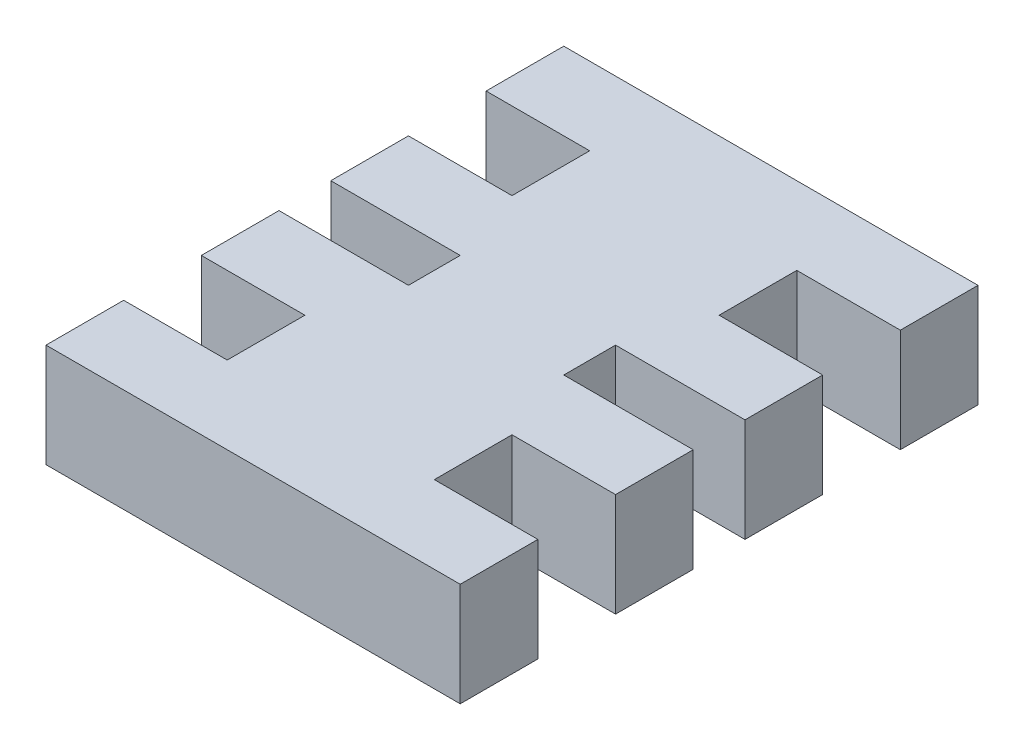
ISO-10303-21;
HEADER;
FILE_DESCRIPTION(('STEP AP214'),'2;1');
FILE_NAME('part.step','',(''),(''),'','','');
FILE_SCHEMA(('AUTOMOTIVE_DESIGN { 1 0 10303 214 1 1 1 1 }'));
ENDSEC;
DATA;
#1=APPLICATION_CONTEXT('core data for automotive mechanical design processes');
#2=APPLICATION_PROTOCOL_DEFINITION('international standard','automotive_design',2000,#1);
#3=PRODUCT_CONTEXT('',#1,'mechanical');
#4=PRODUCT('Part','Part','',(#3));
#5=PRODUCT_RELATED_PRODUCT_CATEGORY('part','',(#4));
#6=PRODUCT_DEFINITION_FORMATION('','',#4);
#7=PRODUCT_DEFINITION_CONTEXT('part definition',#1,'design');
#8=PRODUCT_DEFINITION('design','',#6,#7);
#9=PRODUCT_DEFINITION_SHAPE('','',#8);
#10=(LENGTH_UNIT() NAMED_UNIT(*) SI_UNIT(.MILLI.,.METRE.));
#11=(NAMED_UNIT(*) PLANE_ANGLE_UNIT() SI_UNIT($,.RADIAN.));
#12=(NAMED_UNIT(*) SI_UNIT($,.STERADIAN.) SOLID_ANGLE_UNIT());
#13=UNCERTAINTY_MEASURE_WITH_UNIT(LENGTH_MEASURE(1.E-05),#10,'distance_accuracy_value','');
#14=(GEOMETRIC_REPRESENTATION_CONTEXT(3) GLOBAL_UNCERTAINTY_ASSIGNED_CONTEXT((#13)) GLOBAL_UNIT_ASSIGNED_CONTEXT((#10,
#11,#12)) REPRESENTATION_CONTEXT('',''));
#15=CARTESIAN_POINT('',(0.,0.,0.));
#16=DIRECTION('',(0.,0.,1.));
#17=DIRECTION('',(1.,0.,0.));
#18=AXIS2_PLACEMENT_3D('',#15,#16,#17);
#19=CARTESIAN_POINT('',(-40.,20.,-55.));
#20=DIRECTION('',(1.,0.,0.));
#21=DIRECTION('',(0.,0.,-1.));
#22=AXIS2_PLACEMENT_3D('',#19,#20,#21);
#23=PLANE('',#22);
#24=DIRECTION('',(0.,0.,1.));
#25=VECTOR('',#24,1.);
#26=CARTESIAN_POINT('',(-40.,0.,-55.));
#27=LINE('',#26,#25);
#28=CARTESIAN_POINT('',(-40.,0.,-55.));
#29=VERTEX_POINT('',#28);
#30=CARTESIAN_POINT('',(-40.,0.,-40.));
#31=VERTEX_POINT('',#30);
#32=EDGE_CURVE('E252',#29,#31,#27,.T.);
#33=ORIENTED_EDGE('',*,*,#32,.T.);
#34=DIRECTION('',(0.,-1.,0.));
#35=VECTOR('',#34,1.);
#36=CARTESIAN_POINT('',(-40.,20.,-40.));
#37=LINE('',#36,#35);
#38=CARTESIAN_POINT('',(-40.,20.,-40.));
#39=VERTEX_POINT('',#38);
#40=EDGE_CURVE('E11',#39,#31,#37,.T.);
#41=ORIENTED_EDGE('',*,*,#40,.F.);
#42=DIRECTION('',(0.,0.,1.));
#43=VECTOR('',#42,1.);
#44=CARTESIAN_POINT('',(-40.,20.,-55.));
#45=LINE('',#44,#43);
#46=CARTESIAN_POINT('',(-40.,20.,-55.));
#47=VERTEX_POINT('',#46);
#48=EDGE_CURVE('E306',#47,#39,#45,.T.);
#49=ORIENTED_EDGE('',*,*,#48,.F.);
#50=DIRECTION('',(0.,-1.,0.));
#51=VECTOR('',#50,1.);
#52=CARTESIAN_POINT('',(-40.,20.,-55.));
#53=LINE('',#52,#51);
#54=EDGE_CURVE('E248',#47,#29,#53,.T.);
#55=ORIENTED_EDGE('',*,*,#54,.T.);
#56=EDGE_LOOP('',(#33,#41,#49,#55));
#57=FACE_BOUND('',#56,.T.);
#58=ADVANCED_FACE('F36',(#57),#23,.F.);
#59=CARTESIAN_POINT('',(-40.,20.,-40.));
#60=DIRECTION('',(0.,0.,-1.));
#61=DIRECTION('',(-1.,0.,0.));
#62=AXIS2_PLACEMENT_3D('',#59,#60,#61);
#63=PLANE('',#62);
#64=DIRECTION('',(1.,0.,0.));
#65=VECTOR('',#64,1.);
#66=CARTESIAN_POINT('',(-40.,0.,-40.));
#67=LINE('',#66,#65);
#68=CARTESIAN_POINT('',(-20.,0.,-40.));
#69=VERTEX_POINT('',#68);
#70=EDGE_CURVE('E255',#31,#69,#67,.T.);
#71=ORIENTED_EDGE('',*,*,#70,.T.);
#72=DIRECTION('',(0.,-1.,0.));
#73=VECTOR('',#72,1.);
#74=CARTESIAN_POINT('',(-20.,20.,-40.));
#75=LINE('',#74,#73);
#76=CARTESIAN_POINT('',(-20.,20.,-40.));
#77=VERTEX_POINT('',#76);
#78=EDGE_CURVE('E44',#77,#69,#75,.T.);
#79=ORIENTED_EDGE('',*,*,#78,.F.);
#80=DIRECTION('',(1.,0.,0.));
#81=VECTOR('',#80,1.);
#82=CARTESIAN_POINT('',(-40.,20.,-40.));
#83=LINE('',#82,#81);
#84=EDGE_CURVE('E155',#39,#77,#83,.T.);
#85=ORIENTED_EDGE('',*,*,#84,.F.);
#86=ORIENTED_EDGE('',*,*,#40,.T.);
#87=EDGE_LOOP('',(#71,#79,#85,#86));
#88=FACE_BOUND('',#87,.T.);
#89=ADVANCED_FACE('F464',(#88),#63,.F.);
#90=CARTESIAN_POINT('',(-20.,20.,-40.));
#91=DIRECTION('',(1.,0.,0.));
#92=DIRECTION('',(0.,0.,-1.));
#93=AXIS2_PLACEMENT_3D('',#90,#91,#92);
#94=PLANE('',#93);
#95=DIRECTION('',(0.,0.,1.));
#96=VECTOR('',#95,1.);
#97=CARTESIAN_POINT('',(-20.,0.,-40.));
#98=LINE('',#97,#96);
#99=CARTESIAN_POINT('',(-20.,0.,-25.));
#100=VERTEX_POINT('',#99);
#101=EDGE_CURVE('E257',#69,#100,#98,.T.);
#102=ORIENTED_EDGE('',*,*,#101,.T.);
#103=DIRECTION('',(0.,-1.,0.));
#104=VECTOR('',#103,1.);
#105=CARTESIAN_POINT('',(-20.,20.,-25.));
#106=LINE('',#105,#104);
#107=CARTESIAN_POINT('',(-20.,20.,-25.));
#108=VERTEX_POINT('',#107);
#109=EDGE_CURVE('E373',#108,#100,#106,.T.);
#110=ORIENTED_EDGE('',*,*,#109,.F.);
#111=DIRECTION('',(0.,0.,1.));
#112=VECTOR('',#111,1.);
#113=CARTESIAN_POINT('',(-20.,20.,-40.));
#114=LINE('',#113,#112);
#115=EDGE_CURVE('E381',#77,#108,#114,.T.);
#116=ORIENTED_EDGE('',*,*,#115,.F.);
#117=ORIENTED_EDGE('',*,*,#78,.T.);
#118=EDGE_LOOP('',(#102,#110,#116,#117));
#119=FACE_BOUND('',#118,.T.);
#120=ADVANCED_FACE('F379',(#119),#94,.F.);
#121=CARTESIAN_POINT('',(-20.,20.,-25.));
#122=DIRECTION('',(0.,0.,1.));
#123=DIRECTION('',(1.,0.,0.));
#124=AXIS2_PLACEMENT_3D('',#121,#122,#123);
#125=PLANE('',#124);
#126=DIRECTION('',(-1.,0.,0.));
#127=VECTOR('',#126,1.);
#128=CARTESIAN_POINT('',(-20.,0.,-25.));
#129=LINE('',#128,#127);
#130=CARTESIAN_POINT('',(-40.,0.,-25.));
#131=VERTEX_POINT('',#130);
#132=EDGE_CURVE('E259',#100,#131,#129,.T.);
#133=ORIENTED_EDGE('',*,*,#132,.T.);
#134=DIRECTION('',(0.,-1.,0.));
#135=VECTOR('',#134,1.);
#136=CARTESIAN_POINT('',(-40.,20.,-25.));
#137=LINE('',#136,#135);
#138=CARTESIAN_POINT('',(-40.,20.,-25.));
#139=VERTEX_POINT('',#138);
#140=EDGE_CURVE('E370',#139,#131,#137,.T.);
#141=ORIENTED_EDGE('',*,*,#140,.F.);
#142=DIRECTION('',(-1.,0.,0.));
#143=VECTOR('',#142,1.);
#144=CARTESIAN_POINT('',(-20.,20.,-25.));
#145=LINE('',#144,#143);
#146=EDGE_CURVE('E399',#108,#139,#145,.T.);
#147=ORIENTED_EDGE('',*,*,#146,.F.);
#148=ORIENTED_EDGE('',*,*,#109,.T.);
#149=EDGE_LOOP('',(#133,#141,#147,#148));
#150=FACE_BOUND('',#149,.T.);
#151=ADVANCED_FACE('F390',(#150),#125,.F.);
#152=CARTESIAN_POINT('',(-40.,20.,-25.));
#153=DIRECTION('',(1.,0.,0.));
#154=DIRECTION('',(0.,0.,-1.));
#155=AXIS2_PLACEMENT_3D('',#152,#153,#154);
#156=PLANE('',#155);
#157=DIRECTION('',(0.,0.,1.));
#158=VECTOR('',#157,1.);
#159=CARTESIAN_POINT('',(-40.,0.,-25.));
#160=LINE('',#159,#158);
#161=CARTESIAN_POINT('',(-40.,0.,-10.));
#162=VERTEX_POINT('',#161);
#163=EDGE_CURVE('E261',#131,#162,#160,.T.);
#164=ORIENTED_EDGE('',*,*,#163,.T.);
#165=DIRECTION('',(0.,-1.,0.));
#166=VECTOR('',#165,1.);
#167=CARTESIAN_POINT('',(-40.,20.,-10.));
#168=LINE('',#167,#166);
#169=CARTESIAN_POINT('',(-40.,20.,-10.));
#170=VERTEX_POINT('',#169);
#171=EDGE_CURVE('E367',#170,#162,#168,.T.);
#172=ORIENTED_EDGE('',*,*,#171,.F.);
#173=DIRECTION('',(0.,0.,1.));
#174=VECTOR('',#173,1.);
#175=CARTESIAN_POINT('',(-40.,20.,-25.));
#176=LINE('',#175,#174);
#177=EDGE_CURVE('E396',#139,#170,#176,.T.);
#178=ORIENTED_EDGE('',*,*,#177,.F.);
#179=ORIENTED_EDGE('',*,*,#140,.T.);
#180=EDGE_LOOP('',(#164,#172,#178,#179));
#181=FACE_BOUND('',#180,.T.);
#182=ADVANCED_FACE('F394',(#181),#156,.F.);
#183=CARTESIAN_POINT('',(-40.,20.,-10.));
#184=DIRECTION('',(0.,0.,-1.));
#185=DIRECTION('',(-1.,0.,0.));
#186=AXIS2_PLACEMENT_3D('',#183,#184,#185);
#187=PLANE('',#186);
#188=DIRECTION('',(1.,0.,0.));
#189=VECTOR('',#188,1.);
#190=CARTESIAN_POINT('',(-40.,0.,-10.));
#191=LINE('',#190,#189);
#192=CARTESIAN_POINT('',(-15.,0.,-10.));
#193=VERTEX_POINT('',#192);
#194=EDGE_CURVE('E263',#162,#193,#191,.T.);
#195=ORIENTED_EDGE('',*,*,#194,.T.);
#196=DIRECTION('',(0.,-1.,0.));
#197=VECTOR('',#196,1.);
#198=CARTESIAN_POINT('',(-15.,20.,-10.));
#199=LINE('',#198,#197);
#200=CARTESIAN_POINT('',(-15.,20.,-10.));
#201=VERTEX_POINT('',#200);
#202=EDGE_CURVE('E364',#201,#193,#199,.T.);
#203=ORIENTED_EDGE('',*,*,#202,.F.);
#204=DIRECTION('',(1.,0.,0.));
#205=VECTOR('',#204,1.);
#206=CARTESIAN_POINT('',(-40.,20.,-10.));
#207=LINE('',#206,#205);
#208=EDGE_CURVE('E398',#170,#201,#207,.T.);
#209=ORIENTED_EDGE('',*,*,#208,.F.);
#210=ORIENTED_EDGE('',*,*,#171,.T.);
#211=EDGE_LOOP('',(#195,#203,#209,#210));
#212=FACE_BOUND('',#211,.T.);
#213=ADVANCED_FACE('F477',(#212),#187,.F.);
#214=CARTESIAN_POINT('',(-15.,20.,-10.));
#215=DIRECTION('',(1.,0.,0.));
#216=DIRECTION('',(0.,0.,-1.));
#217=AXIS2_PLACEMENT_3D('',#214,#215,#216);
#218=PLANE('',#217);
#219=DIRECTION('',(0.,0.,1.));
#220=VECTOR('',#219,1.);
#221=CARTESIAN_POINT('',(-15.,0.,-10.));
#222=LINE('',#221,#220);
#223=CARTESIAN_POINT('',(-15.,0.,0.));
#224=VERTEX_POINT('',#223);
#225=EDGE_CURVE('E265',#193,#224,#222,.T.);
#226=ORIENTED_EDGE('',*,*,#225,.T.);
#227=DIRECTION('',(0.,-1.,0.));
#228=VECTOR('',#227,1.);
#229=CARTESIAN_POINT('',(-15.,20.,0.));
#230=LINE('',#229,#228);
#231=CARTESIAN_POINT('',(-15.,20.,0.));
#232=VERTEX_POINT('',#231);
#233=EDGE_CURVE('E361',#232,#224,#230,.T.);
#234=ORIENTED_EDGE('',*,*,#233,.F.);
#235=DIRECTION('',(0.,0.,1.));
#236=VECTOR('',#235,1.);
#237=CARTESIAN_POINT('',(-15.,20.,-10.));
#238=LINE('',#237,#236);
#239=EDGE_CURVE('E401',#201,#232,#238,.T.);
#240=ORIENTED_EDGE('',*,*,#239,.F.);
#241=ORIENTED_EDGE('',*,*,#202,.T.);
#242=EDGE_LOOP('',(#226,#234,#240,#241));
#243=FACE_BOUND('',#242,.T.);
#244=ADVANCED_FACE('F480',(#243),#218,.F.);
#245=CARTESIAN_POINT('',(-15.,20.,0.));
#246=DIRECTION('',(0.,0.,1.));
#247=DIRECTION('',(1.,0.,0.));
#248=AXIS2_PLACEMENT_3D('',#245,#246,#247);
#249=PLANE('',#248);
#250=DIRECTION('',(-1.,0.,0.));
#251=VECTOR('',#250,1.);
#252=CARTESIAN_POINT('',(-15.,0.,0.));
#253=LINE('',#252,#251);
#254=CARTESIAN_POINT('',(-40.,0.,0.));
#255=VERTEX_POINT('',#254);
#256=EDGE_CURVE('E267',#224,#255,#253,.T.);
#257=ORIENTED_EDGE('',*,*,#256,.T.);
#258=DIRECTION('',(0.,-1.,0.));
#259=VECTOR('',#258,1.);
#260=CARTESIAN_POINT('',(-40.,20.,0.));
#261=LINE('',#260,#259);
#262=CARTESIAN_POINT('',(-40.,20.,0.));
#263=VERTEX_POINT('',#262);
#264=EDGE_CURVE('E358',#263,#255,#261,.T.);
#265=ORIENTED_EDGE('',*,*,#264,.F.);
#266=DIRECTION('',(-1.,0.,0.));
#267=VECTOR('',#266,1.);
#268=CARTESIAN_POINT('',(-15.,20.,0.));
#269=LINE('',#268,#267);
#270=EDGE_CURVE('E407',#232,#263,#269,.T.);
#271=ORIENTED_EDGE('',*,*,#270,.F.);
#272=ORIENTED_EDGE('',*,*,#233,.T.);
#273=EDGE_LOOP('',(#257,#265,#271,#272));
#274=FACE_BOUND('',#273,.T.);
#275=ADVANCED_FACE('F484',(#274),#249,.F.);
#276=CARTESIAN_POINT('',(-40.,20.,0.));
#277=DIRECTION('',(1.,0.,0.));
#278=DIRECTION('',(0.,0.,-1.));
#279=AXIS2_PLACEMENT_3D('',#276,#277,#278);
#280=PLANE('',#279);
#281=DIRECTION('',(0.,0.,1.));
#282=VECTOR('',#281,1.);
#283=CARTESIAN_POINT('',(-40.,0.,0.));
#284=LINE('',#283,#282);
#285=CARTESIAN_POINT('',(-40.,0.,15.));
#286=VERTEX_POINT('',#285);
#287=EDGE_CURVE('E269',#255,#286,#284,.T.);
#288=ORIENTED_EDGE('',*,*,#287,.T.);
#289=DIRECTION('',(0.,-1.,0.));
#290=VECTOR('',#289,1.);
#291=CARTESIAN_POINT('',(-40.,20.,15.));
#292=LINE('',#291,#290);
#293=CARTESIAN_POINT('',(-40.,20.,15.));
#294=VERTEX_POINT('',#293);
#295=EDGE_CURVE('E355',#294,#286,#292,.T.);
#296=ORIENTED_EDGE('',*,*,#295,.F.);
#297=DIRECTION('',(0.,0.,1.));
#298=VECTOR('',#297,1.);
#299=CARTESIAN_POINT('',(-40.,20.,0.));
#300=LINE('',#299,#298);
#301=EDGE_CURVE('E409',#263,#294,#300,.T.);
#302=ORIENTED_EDGE('',*,*,#301,.F.);
#303=ORIENTED_EDGE('',*,*,#264,.T.);
#304=EDGE_LOOP('',(#288,#296,#302,#303));
#305=FACE_BOUND('',#304,.T.);
#306=ADVANCED_FACE('F488',(#305),#280,.F.);
#307=CARTESIAN_POINT('',(-40.,20.,15.));
#308=DIRECTION('',(0.,0.,-1.));
#309=DIRECTION('',(-1.,0.,0.));
#310=AXIS2_PLACEMENT_3D('',#307,#308,#309);
#311=PLANE('',#310);
#312=DIRECTION('',(1.,0.,0.));
#313=VECTOR('',#312,1.);
#314=CARTESIAN_POINT('',(-40.,0.,15.));
#315=LINE('',#314,#313);
#316=CARTESIAN_POINT('',(-20.,0.,15.));
#317=VERTEX_POINT('',#316);
#318=EDGE_CURVE('E271',#286,#317,#315,.T.);
#319=ORIENTED_EDGE('',*,*,#318,.T.);
#320=DIRECTION('',(0.,-1.,0.));
#321=VECTOR('',#320,1.);
#322=CARTESIAN_POINT('',(-20.,20.,15.));
#323=LINE('',#322,#321);
#324=CARTESIAN_POINT('',(-20.,20.,15.));
#325=VERTEX_POINT('',#324);
#326=EDGE_CURVE('E352',#325,#317,#323,.T.);
#327=ORIENTED_EDGE('',*,*,#326,.F.);
#328=DIRECTION('',(1.,0.,0.));
#329=VECTOR('',#328,1.);
#330=CARTESIAN_POINT('',(-40.,20.,15.));
#331=LINE('',#330,#329);
#332=EDGE_CURVE('E411',#294,#325,#331,.T.);
#333=ORIENTED_EDGE('',*,*,#332,.F.);
#334=ORIENTED_EDGE('',*,*,#295,.T.);
#335=EDGE_LOOP('',(#319,#327,#333,#334));
#336=FACE_BOUND('',#335,.T.);
#337=ADVANCED_FACE('F492',(#336),#311,.F.);
#338=CARTESIAN_POINT('',(-20.,20.,15.));
#339=DIRECTION('',(1.,0.,0.));
#340=DIRECTION('',(0.,0.,-1.));
#341=AXIS2_PLACEMENT_3D('',#338,#339,#340);
#342=PLANE('',#341);
#343=DIRECTION('',(0.,0.,1.));
#344=VECTOR('',#343,1.);
#345=CARTESIAN_POINT('',(-20.,0.,15.));
#346=LINE('',#345,#344);
#347=CARTESIAN_POINT('',(-20.,0.,30.));
#348=VERTEX_POINT('',#347);
#349=EDGE_CURVE('E273',#317,#348,#346,.T.);
#350=ORIENTED_EDGE('',*,*,#349,.T.);
#351=DIRECTION('',(0.,-1.,0.));
#352=VECTOR('',#351,1.);
#353=CARTESIAN_POINT('',(-20.,20.,30.));
#354=LINE('',#353,#352);
#355=CARTESIAN_POINT('',(-20.,20.,30.));
#356=VERTEX_POINT('',#355);
#357=EDGE_CURVE('E349',#356,#348,#354,.T.);
#358=ORIENTED_EDGE('',*,*,#357,.F.);
#359=DIRECTION('',(0.,0.,1.));
#360=VECTOR('',#359,1.);
#361=CARTESIAN_POINT('',(-20.,20.,15.));
#362=LINE('',#361,#360);
#363=EDGE_CURVE('E413',#325,#356,#362,.T.);
#364=ORIENTED_EDGE('',*,*,#363,.F.);
#365=ORIENTED_EDGE('',*,*,#326,.T.);
#366=EDGE_LOOP('',(#350,#358,#364,#365));
#367=FACE_BOUND('',#366,.T.);
#368=ADVANCED_FACE('F496',(#367),#342,.F.);
#369=CARTESIAN_POINT('',(-20.,20.,30.));
#370=DIRECTION('',(0.,0.,1.));
#371=DIRECTION('',(1.,0.,0.));
#372=AXIS2_PLACEMENT_3D('',#369,#370,#371);
#373=PLANE('',#372);
#374=DIRECTION('',(-1.,0.,0.));
#375=VECTOR('',#374,1.);
#376=CARTESIAN_POINT('',(-20.,0.,30.));
#377=LINE('',#376,#375);
#378=CARTESIAN_POINT('',(-40.,0.,30.));
#379=VERTEX_POINT('',#378);
#380=EDGE_CURVE('E275',#348,#379,#377,.T.);
#381=ORIENTED_EDGE('',*,*,#380,.T.);
#382=DIRECTION('',(0.,-1.,0.));
#383=VECTOR('',#382,1.);
#384=CARTESIAN_POINT('',(-40.,20.,30.));
#385=LINE('',#384,#383);
#386=CARTESIAN_POINT('',(-40.,20.,30.));
#387=VERTEX_POINT('',#386);
#388=EDGE_CURVE('E346',#387,#379,#385,.T.);
#389=ORIENTED_EDGE('',*,*,#388,.F.);
#390=DIRECTION('',(-1.,0.,0.));
#391=VECTOR('',#390,1.);
#392=CARTESIAN_POINT('',(-20.,20.,30.));
#393=LINE('',#392,#391);
#394=EDGE_CURVE('E415',#356,#387,#393,.T.);
#395=ORIENTED_EDGE('',*,*,#394,.F.);
#396=ORIENTED_EDGE('',*,*,#357,.T.);
#397=EDGE_LOOP('',(#381,#389,#395,#396));
#398=FACE_BOUND('',#397,.T.);
#399=ADVANCED_FACE('F500',(#398),#373,.F.);
#400=CARTESIAN_POINT('',(-40.,20.,30.));
#401=DIRECTION('',(1.,0.,0.));
#402=DIRECTION('',(0.,0.,-1.));
#403=AXIS2_PLACEMENT_3D('',#400,#401,#402);
#404=PLANE('',#403);
#405=DIRECTION('',(0.,0.,1.));
#406=VECTOR('',#405,1.);
#407=CARTESIAN_POINT('',(-40.,0.,30.));
#408=LINE('',#407,#406);
#409=CARTESIAN_POINT('',(-40.,0.,45.));
#410=VERTEX_POINT('',#409);
#411=EDGE_CURVE('E277',#379,#410,#408,.T.);
#412=ORIENTED_EDGE('',*,*,#411,.T.);
#413=DIRECTION('',(0.,-1.,0.));
#414=VECTOR('',#413,1.);
#415=CARTESIAN_POINT('',(-40.,20.,45.));
#416=LINE('',#415,#414);
#417=CARTESIAN_POINT('',(-40.,20.,45.));
#418=VERTEX_POINT('',#417);
#419=EDGE_CURVE('E343',#418,#410,#416,.T.);
#420=ORIENTED_EDGE('',*,*,#419,.F.);
#421=DIRECTION('',(0.,0.,1.));
#422=VECTOR('',#421,1.);
#423=CARTESIAN_POINT('',(-40.,20.,30.));
#424=LINE('',#423,#422);
#425=EDGE_CURVE('E417',#387,#418,#424,.T.);
#426=ORIENTED_EDGE('',*,*,#425,.F.);
#427=ORIENTED_EDGE('',*,*,#388,.T.);
#428=EDGE_LOOP('',(#412,#420,#426,#427));
#429=FACE_BOUND('',#428,.T.);
#430=ADVANCED_FACE('F504',(#429),#404,.F.);
#431=CARTESIAN_POINT('',(-40.,20.,45.));
#432=DIRECTION('',(0.,0.,-1.));
#433=DIRECTION('',(-1.,0.,0.));
#434=AXIS2_PLACEMENT_3D('',#431,#432,#433);
#435=PLANE('',#434);
#436=DIRECTION('',(1.,0.,0.));
#437=VECTOR('',#436,1.);
#438=CARTESIAN_POINT('',(-40.,0.,45.));
#439=LINE('',#438,#437);
#440=CARTESIAN_POINT('',(40.,0.,45.));
#441=VERTEX_POINT('',#440);
#442=EDGE_CURVE('E279',#410,#441,#439,.T.);
#443=ORIENTED_EDGE('',*,*,#442,.T.);
#444=DIRECTION('',(0.,-1.,0.));
#445=VECTOR('',#444,1.);
#446=CARTESIAN_POINT('',(40.,20.,45.));
#447=LINE('',#446,#445);
#448=CARTESIAN_POINT('',(40.,20.,45.));
#449=VERTEX_POINT('',#448);
#450=EDGE_CURVE('E340',#449,#441,#447,.T.);
#451=ORIENTED_EDGE('',*,*,#450,.F.);
#452=DIRECTION('',(1.,0.,0.));
#453=VECTOR('',#452,1.);
#454=CARTESIAN_POINT('',(-40.,20.,45.));
#455=LINE('',#454,#453);
#456=EDGE_CURVE('E419',#418,#449,#455,.T.);
#457=ORIENTED_EDGE('',*,*,#456,.F.);
#458=ORIENTED_EDGE('',*,*,#419,.T.);
#459=EDGE_LOOP('',(#443,#451,#457,#458));
#460=FACE_BOUND('',#459,.T.);
#461=ADVANCED_FACE('F508',(#460),#435,.F.);
#462=CARTESIAN_POINT('',(40.,20.,30.));
#463=DIRECTION('',(-1.,0.,0.));
#464=DIRECTION('',(0.,0.,1.));
#465=AXIS2_PLACEMENT_3D('',#462,#463,#464);
#466=PLANE('',#465);
#467=DIRECTION('',(0.,0.,-1.));
#468=VECTOR('',#467,1.);
#469=CARTESIAN_POINT('',(40.,0.,30.));
#470=LINE('',#469,#468);
#471=CARTESIAN_POINT('',(40.,0.,30.));
#472=VERTEX_POINT('',#471);
#473=EDGE_CURVE('E281',#441,#472,#470,.T.);
#474=ORIENTED_EDGE('',*,*,#473,.T.);
#475=DIRECTION('',(0.,-1.,0.));
#476=VECTOR('',#475,1.);
#477=CARTESIAN_POINT('',(40.,20.,30.));
#478=LINE('',#477,#476);
#479=CARTESIAN_POINT('',(40.,20.,30.));
#480=VERTEX_POINT('',#479);
#481=EDGE_CURVE('E337',#480,#472,#478,.T.);
#482=ORIENTED_EDGE('',*,*,#481,.F.);
#483=DIRECTION('',(0.,0.,-1.));
#484=VECTOR('',#483,1.);
#485=CARTESIAN_POINT('',(40.,20.,30.));
#486=LINE('',#485,#484);
#487=EDGE_CURVE('E421',#449,#480,#486,.T.);
#488=ORIENTED_EDGE('',*,*,#487,.F.);
#489=ORIENTED_EDGE('',*,*,#450,.T.);
#490=EDGE_LOOP('',(#474,#482,#488,#489));
#491=FACE_BOUND('',#490,.T.);
#492=ADVANCED_FACE('F512',(#491),#466,.F.);
#493=CARTESIAN_POINT('',(20.,20.,30.));
#494=DIRECTION('',(0.,0.,1.));
#495=DIRECTION('',(1.,0.,0.));
#496=AXIS2_PLACEMENT_3D('',#493,#494,#495);
#497=PLANE('',#496);
#498=DIRECTION('',(-1.,0.,0.));
#499=VECTOR('',#498,1.);
#500=CARTESIAN_POINT('',(20.,0.,30.));
#501=LINE('',#500,#499);
#502=CARTESIAN_POINT('',(20.,0.,30.));
#503=VERTEX_POINT('',#502);
#504=EDGE_CURVE('E283',#472,#503,#501,.T.);
#505=ORIENTED_EDGE('',*,*,#504,.T.);
#506=DIRECTION('',(0.,-1.,0.));
#507=VECTOR('',#506,1.);
#508=CARTESIAN_POINT('',(20.,20.,30.));
#509=LINE('',#508,#507);
#510=CARTESIAN_POINT('',(20.,20.,30.));
#511=VERTEX_POINT('',#510);
#512=EDGE_CURVE('E334',#511,#503,#509,.T.);
#513=ORIENTED_EDGE('',*,*,#512,.F.);
#514=DIRECTION('',(-1.,0.,0.));
#515=VECTOR('',#514,1.);
#516=CARTESIAN_POINT('',(20.,20.,30.));
#517=LINE('',#516,#515);
#518=EDGE_CURVE('E423',#480,#511,#517,.T.);
#519=ORIENTED_EDGE('',*,*,#518,.F.);
#520=ORIENTED_EDGE('',*,*,#481,.T.);
#521=EDGE_LOOP('',(#505,#513,#519,#520));
#522=FACE_BOUND('',#521,.T.);
#523=ADVANCED_FACE('F516',(#522),#497,.F.);
#524=CARTESIAN_POINT('',(20.,20.,15.));
#525=DIRECTION('',(-1.,0.,0.));
#526=DIRECTION('',(0.,0.,1.));
#527=AXIS2_PLACEMENT_3D('',#524,#525,#526);
#528=PLANE('',#527);
#529=DIRECTION('',(0.,0.,-1.));
#530=VECTOR('',#529,1.);
#531=CARTESIAN_POINT('',(20.,0.,15.));
#532=LINE('',#531,#530);
#533=CARTESIAN_POINT('',(20.,0.,15.));
#534=VERTEX_POINT('',#533);
#535=EDGE_CURVE('E285',#503,#534,#532,.T.);
#536=ORIENTED_EDGE('',*,*,#535,.T.);
#537=DIRECTION('',(0.,-1.,0.));
#538=VECTOR('',#537,1.);
#539=CARTESIAN_POINT('',(20.,20.,15.));
#540=LINE('',#539,#538);
#541=CARTESIAN_POINT('',(20.,20.,15.));
#542=VERTEX_POINT('',#541);
#543=EDGE_CURVE('E331',#542,#534,#540,.T.);
#544=ORIENTED_EDGE('',*,*,#543,.F.);
#545=DIRECTION('',(0.,0.,-1.));
#546=VECTOR('',#545,1.);
#547=CARTESIAN_POINT('',(20.,20.,15.));
#548=LINE('',#547,#546);
#549=EDGE_CURVE('E425',#511,#542,#548,.T.);
#550=ORIENTED_EDGE('',*,*,#549,.F.);
#551=ORIENTED_EDGE('',*,*,#512,.T.);
#552=EDGE_LOOP('',(#536,#544,#550,#551));
#553=FACE_BOUND('',#552,.T.);
#554=ADVANCED_FACE('F520',(#553),#528,.F.);
#555=CARTESIAN_POINT('',(40.,20.,15.));
#556=DIRECTION('',(0.,0.,-1.));
#557=DIRECTION('',(-1.,0.,0.));
#558=AXIS2_PLACEMENT_3D('',#555,#556,#557);
#559=PLANE('',#558);
#560=DIRECTION('',(1.,0.,0.));
#561=VECTOR('',#560,1.);
#562=CARTESIAN_POINT('',(40.,0.,15.));
#563=LINE('',#562,#561);
#564=CARTESIAN_POINT('',(40.,0.,15.));
#565=VERTEX_POINT('',#564);
#566=EDGE_CURVE('E287',#534,#565,#563,.T.);
#567=ORIENTED_EDGE('',*,*,#566,.T.);
#568=DIRECTION('',(0.,-1.,0.));
#569=VECTOR('',#568,1.);
#570=CARTESIAN_POINT('',(40.,20.,15.));
#571=LINE('',#570,#569);
#572=CARTESIAN_POINT('',(40.,20.,15.));
#573=VERTEX_POINT('',#572);
#574=EDGE_CURVE('E328',#573,#565,#571,.T.);
#575=ORIENTED_EDGE('',*,*,#574,.F.);
#576=DIRECTION('',(1.,0.,0.));
#577=VECTOR('',#576,1.);
#578=CARTESIAN_POINT('',(40.,20.,15.));
#579=LINE('',#578,#577);
#580=EDGE_CURVE('E427',#542,#573,#579,.T.);
#581=ORIENTED_EDGE('',*,*,#580,.F.);
#582=ORIENTED_EDGE('',*,*,#543,.T.);
#583=EDGE_LOOP('',(#567,#575,#581,#582));
#584=FACE_BOUND('',#583,.T.);
#585=ADVANCED_FACE('F524',(#584),#559,.F.);
#586=CARTESIAN_POINT('',(40.,20.,0.));
#587=DIRECTION('',(-1.,0.,0.));
#588=DIRECTION('',(0.,0.,1.));
#589=AXIS2_PLACEMENT_3D('',#586,#587,#588);
#590=PLANE('',#589);
#591=DIRECTION('',(0.,0.,-1.));
#592=VECTOR('',#591,1.);
#593=CARTESIAN_POINT('',(40.,0.,0.));
#594=LINE('',#593,#592);
#595=CARTESIAN_POINT('',(40.,0.,0.));
#596=VERTEX_POINT('',#595);
#597=EDGE_CURVE('E289',#565,#596,#594,.T.);
#598=ORIENTED_EDGE('',*,*,#597,.T.);
#599=DIRECTION('',(0.,-1.,0.));
#600=VECTOR('',#599,1.);
#601=CARTESIAN_POINT('',(40.,20.,0.));
#602=LINE('',#601,#600);
#603=CARTESIAN_POINT('',(40.,20.,0.));
#604=VERTEX_POINT('',#603);
#605=EDGE_CURVE('E325',#604,#596,#602,.T.);
#606=ORIENTED_EDGE('',*,*,#605,.F.);
#607=DIRECTION('',(0.,0.,-1.));
#608=VECTOR('',#607,1.);
#609=CARTESIAN_POINT('',(40.,20.,0.));
#610=LINE('',#609,#608);
#611=EDGE_CURVE('E429',#573,#604,#610,.T.);
#612=ORIENTED_EDGE('',*,*,#611,.F.);
#613=ORIENTED_EDGE('',*,*,#574,.T.);
#614=EDGE_LOOP('',(#598,#606,#612,#613));
#615=FACE_BOUND('',#614,.T.);
#616=ADVANCED_FACE('F528',(#615),#590,.F.);
#617=CARTESIAN_POINT('',(15.,20.,0.));
#618=DIRECTION('',(0.,0.,1.));
#619=DIRECTION('',(1.,0.,0.));
#620=AXIS2_PLACEMENT_3D('',#617,#618,#619);
#621=PLANE('',#620);
#622=DIRECTION('',(-1.,0.,0.));
#623=VECTOR('',#622,1.);
#624=CARTESIAN_POINT('',(15.,0.,0.));
#625=LINE('',#624,#623);
#626=CARTESIAN_POINT('',(15.,0.,0.));
#627=VERTEX_POINT('',#626);
#628=EDGE_CURVE('E291',#596,#627,#625,.T.);
#629=ORIENTED_EDGE('',*,*,#628,.T.);
#630=DIRECTION('',(0.,-1.,0.));
#631=VECTOR('',#630,1.);
#632=CARTESIAN_POINT('',(15.,20.,0.));
#633=LINE('',#632,#631);
#634=CARTESIAN_POINT('',(15.,20.,0.));
#635=VERTEX_POINT('',#634);
#636=EDGE_CURVE('E322',#635,#627,#633,.T.);
#637=ORIENTED_EDGE('',*,*,#636,.F.);
#638=DIRECTION('',(-1.,0.,0.));
#639=VECTOR('',#638,1.);
#640=CARTESIAN_POINT('',(15.,20.,0.));
#641=LINE('',#640,#639);
#642=EDGE_CURVE('E431',#604,#635,#641,.T.);
#643=ORIENTED_EDGE('',*,*,#642,.F.);
#644=ORIENTED_EDGE('',*,*,#605,.T.);
#645=EDGE_LOOP('',(#629,#637,#643,#644));
#646=FACE_BOUND('',#645,.T.);
#647=ADVANCED_FACE('F532',(#646),#621,.F.);
#648=CARTESIAN_POINT('',(15.,20.,-10.));
#649=DIRECTION('',(-1.,0.,0.));
#650=DIRECTION('',(0.,0.,1.));
#651=AXIS2_PLACEMENT_3D('',#648,#649,#650);
#652=PLANE('',#651);
#653=DIRECTION('',(0.,0.,-1.));
#654=VECTOR('',#653,1.);
#655=CARTESIAN_POINT('',(15.,0.,-10.));
#656=LINE('',#655,#654);
#657=CARTESIAN_POINT('',(15.,0.,-10.));
#658=VERTEX_POINT('',#657);
#659=EDGE_CURVE('E293',#627,#658,#656,.T.);
#660=ORIENTED_EDGE('',*,*,#659,.T.);
#661=DIRECTION('',(0.,-1.,0.));
#662=VECTOR('',#661,1.);
#663=CARTESIAN_POINT('',(15.,20.,-10.));
#664=LINE('',#663,#662);
#665=CARTESIAN_POINT('',(15.,20.,-10.));
#666=VERTEX_POINT('',#665);
#667=EDGE_CURVE('E319',#666,#658,#664,.T.);
#668=ORIENTED_EDGE('',*,*,#667,.F.);
#669=DIRECTION('',(0.,0.,-1.));
#670=VECTOR('',#669,1.);
#671=CARTESIAN_POINT('',(15.,20.,-10.));
#672=LINE('',#671,#670);
#673=EDGE_CURVE('E433',#635,#666,#672,.T.);
#674=ORIENTED_EDGE('',*,*,#673,.F.);
#675=ORIENTED_EDGE('',*,*,#636,.T.);
#676=EDGE_LOOP('',(#660,#668,#674,#675));
#677=FACE_BOUND('',#676,.T.);
#678=ADVANCED_FACE('F536',(#677),#652,.F.);
#679=CARTESIAN_POINT('',(40.,20.,-10.));
#680=DIRECTION('',(0.,0.,-1.));
#681=DIRECTION('',(-1.,0.,0.));
#682=AXIS2_PLACEMENT_3D('',#679,#680,#681);
#683=PLANE('',#682);
#684=DIRECTION('',(1.,0.,0.));
#685=VECTOR('',#684,1.);
#686=CARTESIAN_POINT('',(40.,0.,-10.));
#687=LINE('',#686,#685);
#688=CARTESIAN_POINT('',(40.,0.,-10.));
#689=VERTEX_POINT('',#688);
#690=EDGE_CURVE('E295',#658,#689,#687,.T.);
#691=ORIENTED_EDGE('',*,*,#690,.T.);
#692=DIRECTION('',(0.,-1.,0.));
#693=VECTOR('',#692,1.);
#694=CARTESIAN_POINT('',(40.,20.,-10.));
#695=LINE('',#694,#693);
#696=CARTESIAN_POINT('',(40.,20.,-10.));
#697=VERTEX_POINT('',#696);
#698=EDGE_CURVE('E316',#697,#689,#695,.T.);
#699=ORIENTED_EDGE('',*,*,#698,.F.);
#700=DIRECTION('',(1.,0.,0.));
#701=VECTOR('',#700,1.);
#702=CARTESIAN_POINT('',(40.,20.,-10.));
#703=LINE('',#702,#701);
#704=EDGE_CURVE('E435',#666,#697,#703,.T.);
#705=ORIENTED_EDGE('',*,*,#704,.F.);
#706=ORIENTED_EDGE('',*,*,#667,.T.);
#707=EDGE_LOOP('',(#691,#699,#705,#706));
#708=FACE_BOUND('',#707,.T.);
#709=ADVANCED_FACE('F540',(#708),#683,.F.);
#710=CARTESIAN_POINT('',(40.,20.,-25.));
#711=DIRECTION('',(-1.,0.,0.));
#712=DIRECTION('',(0.,0.,1.));
#713=AXIS2_PLACEMENT_3D('',#710,#711,#712);
#714=PLANE('',#713);
#715=DIRECTION('',(0.,0.,-1.));
#716=VECTOR('',#715,1.);
#717=CARTESIAN_POINT('',(40.,0.,-25.));
#718=LINE('',#717,#716);
#719=CARTESIAN_POINT('',(40.,0.,-25.));
#720=VERTEX_POINT('',#719);
#721=EDGE_CURVE('E297',#689,#720,#718,.T.);
#722=ORIENTED_EDGE('',*,*,#721,.T.);
#723=DIRECTION('',(0.,-1.,0.));
#724=VECTOR('',#723,1.);
#725=CARTESIAN_POINT('',(40.,20.,-25.));
#726=LINE('',#725,#724);
#727=CARTESIAN_POINT('',(40.,20.,-25.));
#728=VERTEX_POINT('',#727);
#729=EDGE_CURVE('E313',#728,#720,#726,.T.);
#730=ORIENTED_EDGE('',*,*,#729,.F.);
#731=DIRECTION('',(0.,0.,-1.));
#732=VECTOR('',#731,1.);
#733=CARTESIAN_POINT('',(40.,20.,-25.));
#734=LINE('',#733,#732);
#735=EDGE_CURVE('E437',#697,#728,#734,.T.);
#736=ORIENTED_EDGE('',*,*,#735,.F.);
#737=ORIENTED_EDGE('',*,*,#698,.T.);
#738=EDGE_LOOP('',(#722,#730,#736,#737));
#739=FACE_BOUND('',#738,.T.);
#740=ADVANCED_FACE('F544',(#739),#714,.F.);
#741=CARTESIAN_POINT('',(20.,20.,-25.));
#742=DIRECTION('',(0.,0.,1.));
#743=DIRECTION('',(1.,0.,0.));
#744=AXIS2_PLACEMENT_3D('',#741,#742,#743);
#745=PLANE('',#744);
#746=DIRECTION('',(-1.,0.,0.));
#747=VECTOR('',#746,1.);
#748=CARTESIAN_POINT('',(20.,0.,-25.));
#749=LINE('',#748,#747);
#750=CARTESIAN_POINT('',(20.,0.,-25.));
#751=VERTEX_POINT('',#750);
#752=EDGE_CURVE('E299',#720,#751,#749,.T.);
#753=ORIENTED_EDGE('',*,*,#752,.T.);
#754=DIRECTION('',(0.,-1.,0.));
#755=VECTOR('',#754,1.);
#756=CARTESIAN_POINT('',(20.,20.,-25.));
#757=LINE('',#756,#755);
#758=CARTESIAN_POINT('',(20.,20.,-25.));
#759=VERTEX_POINT('',#758);
#760=EDGE_CURVE('E310',#759,#751,#757,.T.);
#761=ORIENTED_EDGE('',*,*,#760,.F.);
#762=DIRECTION('',(-1.,0.,0.));
#763=VECTOR('',#762,1.);
#764=CARTESIAN_POINT('',(20.,20.,-25.));
#765=LINE('',#764,#763);
#766=EDGE_CURVE('E439',#728,#759,#765,.T.);
#767=ORIENTED_EDGE('',*,*,#766,.F.);
#768=ORIENTED_EDGE('',*,*,#729,.T.);
#769=EDGE_LOOP('',(#753,#761,#767,#768));
#770=FACE_BOUND('',#769,.T.);
#771=ADVANCED_FACE('F445',(#770),#745,.F.);
#772=CARTESIAN_POINT('',(20.,20.,-40.));
#773=DIRECTION('',(-1.,0.,0.));
#774=DIRECTION('',(0.,0.,1.));
#775=AXIS2_PLACEMENT_3D('',#772,#773,#774);
#776=PLANE('',#775);
#777=DIRECTION('',(0.,0.,-1.));
#778=VECTOR('',#777,1.);
#779=CARTESIAN_POINT('',(20.,0.,-40.));
#780=LINE('',#779,#778);
#781=CARTESIAN_POINT('',(20.,0.,-40.));
#782=VERTEX_POINT('',#781);
#783=EDGE_CURVE('E301',#751,#782,#780,.T.);
#784=ORIENTED_EDGE('',*,*,#783,.T.);
#785=DIRECTION('',(0.,-1.,0.));
#786=VECTOR('',#785,1.);
#787=CARTESIAN_POINT('',(20.,20.,-40.));
#788=LINE('',#787,#786);
#789=CARTESIAN_POINT('',(20.,20.,-40.));
#790=VERTEX_POINT('',#789);
#791=EDGE_CURVE('E243',#790,#782,#788,.T.);
#792=ORIENTED_EDGE('',*,*,#791,.F.);
#793=DIRECTION('',(0.,0.,-1.));
#794=VECTOR('',#793,1.);
#795=CARTESIAN_POINT('',(20.,20.,-40.));
#796=LINE('',#795,#794);
#797=EDGE_CURVE('E234',#759,#790,#796,.T.);
#798=ORIENTED_EDGE('',*,*,#797,.F.);
#799=ORIENTED_EDGE('',*,*,#760,.T.);
#800=EDGE_LOOP('',(#784,#792,#798,#799));
#801=FACE_BOUND('',#800,.T.);
#802=ADVANCED_FACE('F449',(#801),#776,.F.);
#803=CARTESIAN_POINT('',(40.,20.,-40.));
#804=DIRECTION('',(0.,0.,-1.));
#805=DIRECTION('',(-1.,0.,0.));
#806=AXIS2_PLACEMENT_3D('',#803,#804,#805);
#807=PLANE('',#806);
#808=DIRECTION('',(1.,0.,0.));
#809=VECTOR('',#808,1.);
#810=CARTESIAN_POINT('',(40.,0.,-40.));
#811=LINE('',#810,#809);
#812=CARTESIAN_POINT('',(40.,0.,-40.));
#813=VERTEX_POINT('',#812);
#814=EDGE_CURVE('E242',#782,#813,#811,.T.);
#815=ORIENTED_EDGE('',*,*,#814,.T.);
#816=DIRECTION('',(0.,-1.,0.));
#817=VECTOR('',#816,1.);
#818=CARTESIAN_POINT('',(40.,20.,-40.));
#819=LINE('',#818,#817);
#820=CARTESIAN_POINT('',(40.,20.,-40.));
#821=VERTEX_POINT('',#820);
#822=EDGE_CURVE('E239',#821,#813,#819,.T.);
#823=ORIENTED_EDGE('',*,*,#822,.F.);
#824=DIRECTION('',(1.,0.,0.));
#825=VECTOR('',#824,1.);
#826=CARTESIAN_POINT('',(40.,20.,-40.));
#827=LINE('',#826,#825);
#828=EDGE_CURVE('E228',#790,#821,#827,.T.);
#829=ORIENTED_EDGE('',*,*,#828,.F.);
#830=ORIENTED_EDGE('',*,*,#791,.T.);
#831=EDGE_LOOP('',(#815,#823,#829,#830));
#832=FACE_BOUND('',#831,.T.);
#833=ADVANCED_FACE('F240',(#832),#807,.F.);
#834=CARTESIAN_POINT('',(40.,20.,-55.));
#835=DIRECTION('',(-1.,0.,0.));
#836=DIRECTION('',(0.,0.,1.));
#837=AXIS2_PLACEMENT_3D('',#834,#835,#836);
#838=PLANE('',#837);
#839=DIRECTION('',(0.,0.,-1.));
#840=VECTOR('',#839,1.);
#841=CARTESIAN_POINT('',(40.,0.,-55.));
#842=LINE('',#841,#840);
#843=CARTESIAN_POINT('',(40.,0.,-55.));
#844=VERTEX_POINT('',#843);
#845=EDGE_CURVE('E141',#813,#844,#842,.T.);
#846=ORIENTED_EDGE('',*,*,#845,.T.);
#847=DIRECTION('',(0.,-1.,0.));
#848=VECTOR('',#847,1.);
#849=CARTESIAN_POINT('',(40.,20.,-55.));
#850=LINE('',#849,#848);
#851=CARTESIAN_POINT('',(40.,20.,-55.));
#852=VERTEX_POINT('',#851);
#853=EDGE_CURVE('E244',#852,#844,#850,.T.);
#854=ORIENTED_EDGE('',*,*,#853,.F.);
#855=DIRECTION('',(0.,0.,-1.));
#856=VECTOR('',#855,1.);
#857=CARTESIAN_POINT('',(40.,20.,-55.));
#858=LINE('',#857,#856);
#859=EDGE_CURVE('E232',#821,#852,#858,.T.);
#860=ORIENTED_EDGE('',*,*,#859,.F.);
#861=ORIENTED_EDGE('',*,*,#822,.T.);
#862=EDGE_LOOP('',(#846,#854,#860,#861));
#863=FACE_BOUND('',#862,.T.);
#864=ADVANCED_FACE('F246',(#863),#838,.F.);
#865=CARTESIAN_POINT('',(40.,20.,-55.));
#866=DIRECTION('',(0.,0.,1.));
#867=DIRECTION('',(1.,0.,0.));
#868=AXIS2_PLACEMENT_3D('',#865,#866,#867);
#869=PLANE('',#868);
#870=DIRECTION('',(-1.,0.,0.));
#871=VECTOR('',#870,1.);
#872=CARTESIAN_POINT('',(40.,0.,-55.));
#873=LINE('',#872,#871);
#874=EDGE_CURVE('E147',#844,#29,#873,.T.);
#875=ORIENTED_EDGE('',*,*,#874,.T.);
#876=ORIENTED_EDGE('',*,*,#54,.F.);
#877=DIRECTION('',(-1.,0.,0.));
#878=VECTOR('',#877,1.);
#879=CARTESIAN_POINT('',(40.,20.,-55.));
#880=LINE('',#879,#878);
#881=EDGE_CURVE('E52',#852,#47,#880,.T.);
#882=ORIENTED_EDGE('',*,*,#881,.F.);
#883=ORIENTED_EDGE('',*,*,#853,.T.);
#884=EDGE_LOOP('',(#875,#876,#882,#883));
#885=FACE_BOUND('',#884,.T.);
#886=ADVANCED_FACE('F453',(#885),#869,.F.);
#887=CARTESIAN_POINT('',(0.,20.,0.));
#888=DIRECTION('',(0.,1.,0.));
#889=DIRECTION('',(0.,0.,1.));
#890=AXIS2_PLACEMENT_3D('',#887,#888,#889);
#891=PLANE('',#890);
#892=ORIENTED_EDGE('',*,*,#48,.T.);
#893=ORIENTED_EDGE('',*,*,#84,.T.);
#894=ORIENTED_EDGE('',*,*,#115,.T.);
#895=ORIENTED_EDGE('',*,*,#146,.T.);
#896=ORIENTED_EDGE('',*,*,#177,.T.);
#897=ORIENTED_EDGE('',*,*,#208,.T.);
#898=ORIENTED_EDGE('',*,*,#239,.T.);
#899=ORIENTED_EDGE('',*,*,#270,.T.);
#900=ORIENTED_EDGE('',*,*,#301,.T.);
#901=ORIENTED_EDGE('',*,*,#332,.T.);
#902=ORIENTED_EDGE('',*,*,#363,.T.);
#903=ORIENTED_EDGE('',*,*,#394,.T.);
#904=ORIENTED_EDGE('',*,*,#425,.T.);
#905=ORIENTED_EDGE('',*,*,#456,.T.);
#906=ORIENTED_EDGE('',*,*,#487,.T.);
#907=ORIENTED_EDGE('',*,*,#518,.T.);
#908=ORIENTED_EDGE('',*,*,#549,.T.);
#909=ORIENTED_EDGE('',*,*,#580,.T.);
#910=ORIENTED_EDGE('',*,*,#611,.T.);
#911=ORIENTED_EDGE('',*,*,#642,.T.);
#912=ORIENTED_EDGE('',*,*,#673,.T.);
#913=ORIENTED_EDGE('',*,*,#704,.T.);
#914=ORIENTED_EDGE('',*,*,#735,.T.);
#915=ORIENTED_EDGE('',*,*,#766,.T.);
#916=ORIENTED_EDGE('',*,*,#797,.T.);
#917=ORIENTED_EDGE('',*,*,#828,.T.);
#918=ORIENTED_EDGE('',*,*,#859,.T.);
#919=ORIENTED_EDGE('',*,*,#881,.T.);
#920=EDGE_LOOP('',(#892,#893,#894,#895,#896,#897,#898,#899,#900,#901,#902,#903,#904,#905,#906,
#907,#908,#909,#910,#911,#912,#913,#914,#915,#916,#917,#918,#919));
#921=FACE_BOUND('',#920,.T.);
#922=ADVANCED_FACE('F230',(#921),#891,.T.);
#923=CARTESIAN_POINT('',(0.,0.,0.));
#924=DIRECTION('',(0.,1.,0.));
#925=DIRECTION('',(0.,0.,1.));
#926=AXIS2_PLACEMENT_3D('',#923,#924,#925);
#927=PLANE('',#926);
#928=ORIENTED_EDGE('',*,*,#32,.F.);
#929=ORIENTED_EDGE('',*,*,#874,.F.);
#930=ORIENTED_EDGE('',*,*,#845,.F.);
#931=ORIENTED_EDGE('',*,*,#814,.F.);
#932=ORIENTED_EDGE('',*,*,#783,.F.);
#933=ORIENTED_EDGE('',*,*,#752,.F.);
#934=ORIENTED_EDGE('',*,*,#721,.F.);
#935=ORIENTED_EDGE('',*,*,#690,.F.);
#936=ORIENTED_EDGE('',*,*,#659,.F.);
#937=ORIENTED_EDGE('',*,*,#628,.F.);
#938=ORIENTED_EDGE('',*,*,#597,.F.);
#939=ORIENTED_EDGE('',*,*,#566,.F.);
#940=ORIENTED_EDGE('',*,*,#535,.F.);
#941=ORIENTED_EDGE('',*,*,#504,.F.);
#942=ORIENTED_EDGE('',*,*,#473,.F.);
#943=ORIENTED_EDGE('',*,*,#442,.F.);
#944=ORIENTED_EDGE('',*,*,#411,.F.);
#945=ORIENTED_EDGE('',*,*,#380,.F.);
#946=ORIENTED_EDGE('',*,*,#349,.F.);
#947=ORIENTED_EDGE('',*,*,#318,.F.);
#948=ORIENTED_EDGE('',*,*,#287,.F.);
#949=ORIENTED_EDGE('',*,*,#256,.F.);
#950=ORIENTED_EDGE('',*,*,#225,.F.);
#951=ORIENTED_EDGE('',*,*,#194,.F.);
#952=ORIENTED_EDGE('',*,*,#163,.F.);
#953=ORIENTED_EDGE('',*,*,#132,.F.);
#954=ORIENTED_EDGE('',*,*,#101,.F.);
#955=ORIENTED_EDGE('',*,*,#70,.F.);
#956=EDGE_LOOP('',(#928,#929,#930,#931,#932,#933,#934,#935,#936,#937,#938,#939,#940,#941,#942,
#943,#944,#945,#946,#947,#948,#949,#950,#951,#952,#953,#954,#955));
#957=FACE_BOUND('',#956,.T.);
#958=ADVANCED_FACE('F385',(#957),#927,.F.);
#959=CLOSED_SHELL('',(#58,#89,#120,#151,#182,#213,#244,#275,#306,#337,#368,#399,#430,#461,#492,
#523,#554,#585,#616,#647,#678,#709,#740,#771,#802,#833,#864,#886,#922,#958));
#960=MANIFOLD_SOLID_BREP('B2',#959);
#961=ADVANCED_BREP_SHAPE_REPRESENTATION('',(#18,#960),#14);
#962=SHAPE_DEFINITION_REPRESENTATION(#9,#961);
ENDSEC;
END-ISO-10303-21;
